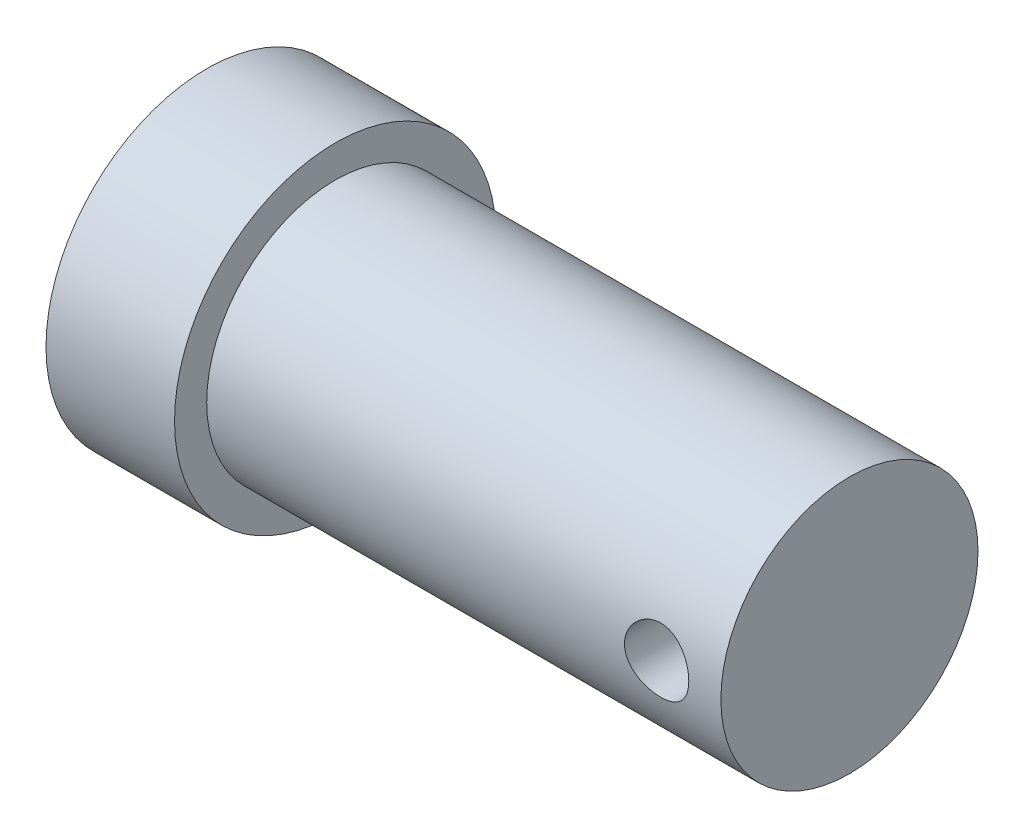
ISO-10303-21;
HEADER;
FILE_DESCRIPTION(('STEP AP214'),'2;1');
FILE_NAME('part.step','',(''),(''),'','','');
FILE_SCHEMA(('AUTOMOTIVE_DESIGN { 1 0 10303 214 1 1 1 1 }'));
ENDSEC;
DATA;
#1=APPLICATION_CONTEXT('core data for automotive mechanical design processes');
#2=APPLICATION_PROTOCOL_DEFINITION('international standard','automotive_design',2000,#1);
#3=PRODUCT_CONTEXT('',#1,'mechanical');
#4=PRODUCT('Part','Part','',(#3));
#5=PRODUCT_RELATED_PRODUCT_CATEGORY('part','',(#4));
#6=PRODUCT_DEFINITION_FORMATION('','',#4);
#7=PRODUCT_DEFINITION_CONTEXT('part definition',#1,'design');
#8=PRODUCT_DEFINITION('design','',#6,#7);
#9=PRODUCT_DEFINITION_SHAPE('','',#8);
#10=(LENGTH_UNIT() NAMED_UNIT(*) SI_UNIT(.MILLI.,.METRE.));
#11=(NAMED_UNIT(*) PLANE_ANGLE_UNIT() SI_UNIT($,.RADIAN.));
#12=(NAMED_UNIT(*) SI_UNIT($,.STERADIAN.) SOLID_ANGLE_UNIT());
#13=UNCERTAINTY_MEASURE_WITH_UNIT(LENGTH_MEASURE(1.E-05),#10,'distance_accuracy_value','');
#14=(GEOMETRIC_REPRESENTATION_CONTEXT(3) GLOBAL_UNCERTAINTY_ASSIGNED_CONTEXT((#13)) GLOBAL_UNIT_ASSIGNED_CONTEXT((#10,
#11,#12)) REPRESENTATION_CONTEXT('',''));
#15=CARTESIAN_POINT('',(0.,0.,0.));
#16=DIRECTION('',(0.,0.,1.));
#17=DIRECTION('',(1.,0.,0.));
#18=AXIS2_PLACEMENT_3D('',#15,#16,#17);
#19=CARTESIAN_POINT('',(0.,0.,0.));
#20=DIRECTION('',(1.,0.,0.));
#21=DIRECTION('',(0.,0.,-1.));
#22=AXIS2_PLACEMENT_3D('',#19,#20,#21);
#23=PLANE('',#22);
#24=CARTESIAN_POINT('',(0.,0.,0.));
#25=DIRECTION('',(-1.,0.,0.));
#26=DIRECTION('',(0.,0.,1.));
#27=AXIS2_PLACEMENT_3D('',#24,#25,#26);
#28=CIRCLE('',#27,25.);
#29=CARTESIAN_POINT('',(0.,0.,25.));
#30=VERTEX_POINT('',#29);
#31=EDGE_CURVE('E45',#30,#30,#28,.T.);
#32=ORIENTED_EDGE('',*,*,#31,.T.);
#33=EDGE_LOOP('',(#32));
#34=FACE_BOUND('',#33,.T.);
#35=ADVANCED_FACE('F30',(#34),#23,.F.);
#36=CARTESIAN_POINT('',(0.,0.,0.));
#37=DIRECTION('',(-1.,0.,0.));
#38=DIRECTION('',(0.,0.,1.));
#39=AXIS2_PLACEMENT_3D('',#36,#37,#38);
#40=CYLINDRICAL_SURFACE('',#39,25.);
#41=ORIENTED_EDGE('',*,*,#31,.F.);
#42=EDGE_LOOP('',(#41));
#43=FACE_BOUND('',#42,.T.);
#44=CARTESIAN_POINT('',(20.,0.,0.));
#45=DIRECTION('',(-1.,0.,0.));
#46=DIRECTION('',(0.,0.,1.));
#47=AXIS2_PLACEMENT_3D('',#44,#45,#46);
#48=CIRCLE('',#47,25.);
#49=CARTESIAN_POINT('',(20.,0.,25.));
#50=VERTEX_POINT('',#49);
#51=EDGE_CURVE('E49',#50,#50,#48,.T.);
#52=ORIENTED_EDGE('',*,*,#51,.T.);
#53=EDGE_LOOP('',(#52));
#54=FACE_BOUND('',#53,.T.);
#55=ADVANCED_FACE('F73',(#43,#54),#40,.T.);
#56=CARTESIAN_POINT('',(20.,25.,0.));
#57=DIRECTION('',(-1.,0.,0.));
#58=DIRECTION('',(0.,0.,1.));
#59=AXIS2_PLACEMENT_3D('',#56,#57,#58);
#60=PLANE('',#59);
#61=ORIENTED_EDGE('',*,*,#51,.F.);
#62=EDGE_LOOP('',(#61));
#63=FACE_BOUND('',#62,.T.);
#64=CARTESIAN_POINT('',(20.,0.,0.));
#65=DIRECTION('',(-1.,0.,0.));
#66=DIRECTION('',(0.,0.,1.));
#67=AXIS2_PLACEMENT_3D('',#64,#65,#66);
#68=CIRCLE('',#67,20.);
#69=CARTESIAN_POINT('',(20.,0.,20.));
#70=VERTEX_POINT('',#69);
#71=EDGE_CURVE('E84',#70,#70,#68,.T.);
#72=ORIENTED_EDGE('',*,*,#71,.T.);
#73=EDGE_LOOP('',(#72));
#74=FACE_BOUND('',#73,.T.);
#75=ADVANCED_FACE('F70',(#63,#74),#60,.F.);
#76=CARTESIAN_POINT('',(0.,0.,0.));
#77=DIRECTION('',(-1.,0.,0.));
#78=DIRECTION('',(0.,0.,1.));
#79=AXIS2_PLACEMENT_3D('',#76,#77,#78);
#80=CYLINDRICAL_SURFACE('',#79,20.);
#81=CARTESIAN_POINT('',(95.,0.,-20.));
#82=CARTESIAN_POINT('',(94.9999922475395,0.276253628899104,-19.9999953289337));
#83=CARTESIAN_POINT('',(94.9770281640874,0.552593859435878,-19.9942192710609));
#84=CARTESIAN_POINT('',(94.88591616231,1.09735441256844,-19.9717371276631));
#85=CARTESIAN_POINT('',(94.8177426348738,1.3657701562358,-19.9550248473325));
#86=CARTESIAN_POINT('',(94.6385358217931,1.88673624060859,-19.9125208777344));
#87=CARTESIAN_POINT('',(94.5275540042825,2.13930521143334,-19.8867400947353));
#88=CARTESIAN_POINT('',(94.2660620331839,2.62224043968143,-19.8288447935874));
#89=CARTESIAN_POINT('',(94.1155505462701,2.85260594782922,-19.7967300618052));
#90=CARTESIAN_POINT('',(93.7759973678194,3.28933975766972,-19.7289137863898));
#91=CARTESIAN_POINT('',(93.5862947501365,3.49518563353686,-19.6931569049375));
#92=CARTESIAN_POINT('',(93.1751593169699,3.87249642401107,-19.6224540039312));
#93=CARTESIAN_POINT('',(92.9537229235102,4.04395745649731,-19.5875080763289));
#94=CARTESIAN_POINT('',(92.48134924421,4.35008847599659,-19.5218258566056));
#95=CARTESIAN_POINT('',(92.2300225639709,4.48417405308381,-19.4911598154937));
#96=CARTESIAN_POINT('',(91.7075052944665,4.70798969516915,-19.4383164939339));
#97=CARTESIAN_POINT('',(91.4363178888933,4.79772685146714,-19.4161378564806));
#98=CARTESIAN_POINT('',(90.8875216726612,4.92851612268255,-19.3833492232108));
#99=CARTESIAN_POINT('',(90.61015034654,4.97050756110685,-19.372516366567));
#100=CARTESIAN_POINT('',(90.0521047700022,5.00753925022137,-19.362978748653));
#101=CARTESIAN_POINT('',(89.7714310643595,5.00258713939371,-19.3642720142643));
#102=CARTESIAN_POINT('',(89.2219473075155,4.94662174879902,-19.3786401838939));
#103=CARTESIAN_POINT('',(88.9530145951156,4.89672780063545,-19.3914287669098));
#104=CARTESIAN_POINT('',(88.4274631636298,4.75408062300998,-19.426890322369));
#105=CARTESIAN_POINT('',(88.1708453232369,4.66132434023131,-19.4495639989746));
#106=CARTESIAN_POINT('',(87.6742066124929,4.43463159312396,-19.5025037968553));
#107=CARTESIAN_POINT('',(87.4343794273681,4.3002888907764,-19.5328442489939));
#108=CARTESIAN_POINT('',(86.9802709674773,3.99452092004982,-19.5976570281997));
#109=CARTESIAN_POINT('',(86.7659941731092,3.82308916269613,-19.6321300778209));
#110=CARTESIAN_POINT('',(86.362654614352,3.44221141560407,-19.7025293513297));
#111=CARTESIAN_POINT('',(86.1744850331288,3.23182086055287,-19.7384689826));
#112=CARTESIAN_POINT('',(85.835929191787,2.78203972501233,-19.8068655192919));
#113=CARTESIAN_POINT('',(85.6855440857881,2.54264825902648,-19.8393223183136));
#114=CARTESIAN_POINT('',(85.4264980459187,2.04038629560464,-19.897257736473));
#115=CARTESIAN_POINT('',(85.3179821991519,1.77743797736208,-19.9227120042576));
#116=CARTESIAN_POINT('',(85.1469423143014,1.23625336047628,-19.9635972330472));
#117=CARTESIAN_POINT('',(85.0844094786062,0.958019997168289,-19.9790301113094));
#118=CARTESIAN_POINT('',(85.0084747814706,0.401799901300098,-19.9978499757125));
#119=CARTESIAN_POINT('',(84.993856579749,0.123989066627374,-20.0015351169426));
#120=CARTESIAN_POINT('',(85.0108300068516,-0.43010958267169,-19.9972934938151));
#121=CARTESIAN_POINT('',(85.0424174759971,-0.706397532148651,-19.9893677747284));
#122=CARTESIAN_POINT('',(85.1499030279712,-1.24538089592163,-19.9629860375784));
#123=CARTESIAN_POINT('',(85.2251375449233,-1.50821706322917,-19.9446878061929));
#124=CARTESIAN_POINT('',(85.4170236134282,-2.01752430817505,-19.899623554472));
#125=CARTESIAN_POINT('',(85.5336793477107,-2.26399373010884,-19.8728566789995));
#126=CARTESIAN_POINT('',(85.8074537629156,-2.73841044809944,-19.8131102642072));
#127=CARTESIAN_POINT('',(85.9652537079886,-2.96595147278589,-19.7800289122193));
#128=CARTESIAN_POINT('',(86.3159663626572,-3.39175537881104,-19.7114836395924));
#129=CARTESIAN_POINT('',(86.5088851320588,-3.59001319657751,-19.676019308434));
#130=CARTESIAN_POINT('',(86.9300065361457,-3.95663522690827,-19.6056318986475));
#131=CARTESIAN_POINT('',(87.1589590099987,-4.12414622540362,-19.57074347274));
#132=CARTESIAN_POINT('',(87.6424421148951,-4.41836919671215,-19.5064292794107));
#133=CARTESIAN_POINT('',(87.8969716099008,-4.54508298053823,-19.4770032695336));
#134=CARTESIAN_POINT('',(88.4230190746882,-4.75317140202426,-19.4272698238587));
#135=CARTESIAN_POINT('',(88.6944254277102,-4.83481465547784,-19.4069085073875));
#136=CARTESIAN_POINT('',(89.2476987928485,-4.95115219981057,-19.3775581342603));
#137=CARTESIAN_POINT('',(89.5295635033954,-4.98585675825596,-19.3685665905607));
#138=CARTESIAN_POINT('',(90.0870700795597,-5.00679530111928,-19.3631633735661));
#139=CARTESIAN_POINT('',(90.3626581171457,-4.99439299259116,-19.366397756045));
#140=CARTESIAN_POINT('',(90.907679628939,-4.92459092769654,-19.3842636317313));
#141=CARTESIAN_POINT('',(91.1771132267195,-4.86719207562107,-19.3988948958968));
#142=CARTESIAN_POINT('',(91.7006948635334,-4.70977106481403,-19.4377086899188));
#143=CARTESIAN_POINT('',(91.9549243507959,-4.61000468226919,-19.461833841343));
#144=CARTESIAN_POINT('',(92.4432179423838,-4.37088304534898,-19.5169251906949));
#145=CARTESIAN_POINT('',(92.6772792439577,-4.23152230011363,-19.5478923373231));
#146=CARTESIAN_POINT('',(93.1251820966721,-3.91289249545748,-19.6141878088207));
#147=CARTESIAN_POINT('',(93.3383369114129,-3.73267720970761,-19.6496088277351));
#148=CARTESIAN_POINT('',(93.7318234826517,-3.33929790396569,-19.7202675748663));
#149=CARTESIAN_POINT('',(93.91214743371,-3.12612607087045,-19.755505257566));
#150=CARTESIAN_POINT('',(94.2380376952153,-2.66822528900865,-19.8225885215915));
#151=CARTESIAN_POINT('',(94.3829153789053,-2.42299474105463,-19.8543611121963));
#152=CARTESIAN_POINT('',(94.6291582098018,-1.91088686503491,-19.9101641658366));
#153=CARTESIAN_POINT('',(94.7305545354951,-1.6440252114558,-19.9342001733259));
#154=CARTESIAN_POINT('',(94.8719061010988,-1.14803417747824,-19.9682686521849));
#155=CARTESIAN_POINT('',(94.9198374768448,-0.921267236360231,-19.9800861684231));
#156=CARTESIAN_POINT('',(94.9838864787398,-0.463020238454279,-19.9959535077316));
#157=CARTESIAN_POINT('',(95.0000064976844,-0.231540537475388,-20.0000039150298));
#158=CARTESIAN_POINT('',(95.,0.,-20.));
#159=B_SPLINE_CURVE_WITH_KNOTS('',3,(#81,#82,#83,#84,#85,#86,#87,#88,#89,#90,#91,#92,#93,#94,
#95,#96,#97,#98,#99,#100,#101,#102,#103,#104,#105,#106,#107,#108,#109,#110,#111,#112,#113,#114,
#115,#116,#117,#118,#119,#120,#121,#122,#123,#124,#125,#126,#127,#128,#129,#130,#131,#132,#133,
#134,#135,#136,#137,#138,#139,#140,#141,#142,#143,#144,#145,#146,#147,#148,#149,#150,#151,#152,
#153,#154,#155,#156,#157,#158),.UNSPECIFIED.,.T.,.F.,(4,2,2,2,2,2,2,2,2,2,2,2,2,2,2,2,2,2,2,2,2,
2,2,2,2,2,2,2,2,2,2,2,2,2,2,2,2,2,4),(0.,0.827912374906301,1.65629412587967,2.48368300762036,
3.31109980056443,4.1538145145713,4.9966243193354,5.85195491819358,6.70714870564562,
7.54520983670233,8.38313460386727,9.20074990034463,10.0184234489786,10.84435092924,
11.6704230279828,12.5200500324113,13.3697029853856,14.2222743004145,15.0746824563988,
15.9052769650866,16.7357967038688,17.5540091505786,18.3723042441871,19.2051195856224,
20.0380787670447,20.8914836402599,21.7448506250943,22.5930751539527,23.4411141086096,
24.2647926801851,25.0884546987996,25.9072133522467,26.7260856048285,27.5663192139288,
28.4067523259457,29.2624061835847,30.1174454609768,30.8114080983367,31.5053185350331),.UNSPECIFIED.);
#160=CARTESIAN_POINT('',(95.,0.,-20.));
#161=VERTEX_POINT('',#160);
#162=EDGE_CURVE('E10',#161,#161,#159,.T.);
#163=ORIENTED_EDGE('',*,*,#162,.T.);
#164=EDGE_LOOP('',(#163));
#165=FACE_BOUND('',#164,.T.);
#166=CARTESIAN_POINT('',(95.,0.,20.));
#167=CARTESIAN_POINT('',(94.9999922475395,-0.276253628899104,19.9999953289337));
#168=CARTESIAN_POINT('',(94.9770281640874,-0.552593859435878,19.9942192710609));
#169=CARTESIAN_POINT('',(94.88591616231,-1.09735441256844,19.9717371276631));
#170=CARTESIAN_POINT('',(94.8177426348738,-1.3657701562358,19.9550248473325));
#171=CARTESIAN_POINT('',(94.6385358217931,-1.88673624060859,19.9125208777344));
#172=CARTESIAN_POINT('',(94.5275540042825,-2.13930521143334,19.8867400947353));
#173=CARTESIAN_POINT('',(94.2660620331839,-2.62224043968143,19.8288447935874));
#174=CARTESIAN_POINT('',(94.1155505462701,-2.85260594782922,19.7967300618052));
#175=CARTESIAN_POINT('',(93.7759973678194,-3.28933975766972,19.7289137863898));
#176=CARTESIAN_POINT('',(93.5862947501365,-3.49518563353686,19.6931569049375));
#177=CARTESIAN_POINT('',(93.1751593169699,-3.87249642401107,19.6224540039312));
#178=CARTESIAN_POINT('',(92.9537229235102,-4.04395745649731,19.5875080763289));
#179=CARTESIAN_POINT('',(92.48134924421,-4.35008847599659,19.5218258566056));
#180=CARTESIAN_POINT('',(92.2300225639709,-4.48417405308381,19.4911598154937));
#181=CARTESIAN_POINT('',(91.7075052944665,-4.70798969516915,19.4383164939339));
#182=CARTESIAN_POINT('',(91.4363178888933,-4.79772685146714,19.4161378564806));
#183=CARTESIAN_POINT('',(90.8875216726612,-4.92851612268255,19.3833492232108));
#184=CARTESIAN_POINT('',(90.61015034654,-4.97050756110685,19.372516366567));
#185=CARTESIAN_POINT('',(90.0521047700022,-5.00753925022137,19.362978748653));
#186=CARTESIAN_POINT('',(89.7714310643595,-5.00258713939371,19.3642720142643));
#187=CARTESIAN_POINT('',(89.2219473075155,-4.94662174879902,19.3786401838939));
#188=CARTESIAN_POINT('',(88.9530145951156,-4.89672780063545,19.3914287669098));
#189=CARTESIAN_POINT('',(88.4274631636298,-4.75408062300998,19.426890322369));
#190=CARTESIAN_POINT('',(88.1708453232369,-4.66132434023131,19.4495639989746));
#191=CARTESIAN_POINT('',(87.6742066124929,-4.43463159312396,19.5025037968553));
#192=CARTESIAN_POINT('',(87.4343794273681,-4.3002888907764,19.5328442489939));
#193=CARTESIAN_POINT('',(86.9802709674773,-3.99452092004982,19.5976570281997));
#194=CARTESIAN_POINT('',(86.7659941731092,-3.82308916269613,19.6321300778209));
#195=CARTESIAN_POINT('',(86.362654614352,-3.44221141560407,19.7025293513297));
#196=CARTESIAN_POINT('',(86.1744850331288,-3.23182086055287,19.7384689826));
#197=CARTESIAN_POINT('',(85.835929191787,-2.78203972501233,19.8068655192919));
#198=CARTESIAN_POINT('',(85.6855440857881,-2.54264825902648,19.8393223183136));
#199=CARTESIAN_POINT('',(85.4264980459187,-2.04038629560464,19.897257736473));
#200=CARTESIAN_POINT('',(85.3179821991519,-1.77743797736208,19.9227120042576));
#201=CARTESIAN_POINT('',(85.1469423143014,-1.23625336047628,19.9635972330472));
#202=CARTESIAN_POINT('',(85.0844094786062,-0.958019997168289,19.9790301113094));
#203=CARTESIAN_POINT('',(85.0084747814706,-0.401799901300098,19.9978499757125));
#204=CARTESIAN_POINT('',(84.993856579749,-0.123989066627374,20.0015351169426));
#205=CARTESIAN_POINT('',(85.0108300068516,0.43010958267169,19.9972934938151));
#206=CARTESIAN_POINT('',(85.0424174759971,0.706397532148651,19.9893677747284));
#207=CARTESIAN_POINT('',(85.1499030279712,1.24538089592163,19.9629860375784));
#208=CARTESIAN_POINT('',(85.2251375449233,1.50821706322917,19.9446878061929));
#209=CARTESIAN_POINT('',(85.4170236134282,2.01752430817505,19.899623554472));
#210=CARTESIAN_POINT('',(85.5336793477107,2.26399373010884,19.8728566789995));
#211=CARTESIAN_POINT('',(85.8074537629156,2.73841044809944,19.8131102642072));
#212=CARTESIAN_POINT('',(85.9652537079886,2.96595147278589,19.7800289122193));
#213=CARTESIAN_POINT('',(86.3159663626572,3.39175537881104,19.7114836395924));
#214=CARTESIAN_POINT('',(86.5088851320588,3.59001319657751,19.676019308434));
#215=CARTESIAN_POINT('',(86.9300065361457,3.95663522690827,19.6056318986475));
#216=CARTESIAN_POINT('',(87.1589590099987,4.12414622540362,19.57074347274));
#217=CARTESIAN_POINT('',(87.6424421148951,4.41836919671215,19.5064292794107));
#218=CARTESIAN_POINT('',(87.8969716099008,4.54508298053823,19.4770032695336));
#219=CARTESIAN_POINT('',(88.4230190746882,4.75317140202426,19.4272698238587));
#220=CARTESIAN_POINT('',(88.6944254277102,4.83481465547784,19.4069085073875));
#221=CARTESIAN_POINT('',(89.2476987928485,4.95115219981057,19.3775581342603));
#222=CARTESIAN_POINT('',(89.5295635033954,4.98585675825596,19.3685665905607));
#223=CARTESIAN_POINT('',(90.0870700795597,5.00679530111928,19.3631633735661));
#224=CARTESIAN_POINT('',(90.3626581171457,4.99439299259116,19.366397756045));
#225=CARTESIAN_POINT('',(90.907679628939,4.92459092769654,19.3842636317313));
#226=CARTESIAN_POINT('',(91.1771132267195,4.86719207562107,19.3988948958968));
#227=CARTESIAN_POINT('',(91.7006948635334,4.70977106481403,19.4377086899188));
#228=CARTESIAN_POINT('',(91.9549243507959,4.61000468226919,19.461833841343));
#229=CARTESIAN_POINT('',(92.4432179423838,4.37088304534898,19.5169251906949));
#230=CARTESIAN_POINT('',(92.6772792439577,4.23152230011363,19.5478923373231));
#231=CARTESIAN_POINT('',(93.1251820966721,3.91289249545748,19.6141878088207));
#232=CARTESIAN_POINT('',(93.3383369114129,3.73267720970761,19.6496088277351));
#233=CARTESIAN_POINT('',(93.7318234826517,3.33929790396569,19.7202675748663));
#234=CARTESIAN_POINT('',(93.91214743371,3.12612607087045,19.755505257566));
#235=CARTESIAN_POINT('',(94.2380376952153,2.66822528900865,19.8225885215915));
#236=CARTESIAN_POINT('',(94.3829153789053,2.42299474105463,19.8543611121963));
#237=CARTESIAN_POINT('',(94.6291582098018,1.91088686503491,19.9101641658366));
#238=CARTESIAN_POINT('',(94.7305545354951,1.6440252114558,19.9342001733259));
#239=CARTESIAN_POINT('',(94.8719061010988,1.14803417747824,19.9682686521849));
#240=CARTESIAN_POINT('',(94.9198374768448,0.921267236360231,19.9800861684231));
#241=CARTESIAN_POINT('',(94.9838864787398,0.463020238454279,19.9959535077316));
#242=CARTESIAN_POINT('',(95.0000064976844,0.231540537475388,20.0000039150298));
#243=CARTESIAN_POINT('',(95.,0.,20.));
#244=B_SPLINE_CURVE_WITH_KNOTS('',3,(#166,#167,#168,#169,#170,#171,#172,#173,#174,#175,#176,
#177,#178,#179,#180,#181,#182,#183,#184,#185,#186,#187,#188,#189,#190,#191,#192,#193,#194,#195,
#196,#197,#198,#199,#200,#201,#202,#203,#204,#205,#206,#207,#208,#209,#210,#211,#212,#213,#214,
#215,#216,#217,#218,#219,#220,#221,#222,#223,#224,#225,#226,#227,#228,#229,#230,#231,#232,#233,
#234,#235,#236,#237,#238,#239,#240,#241,#242,#243),.UNSPECIFIED.,.T.,.F.,(4,2,2,2,2,2,2,2,2,2,2,
2,2,2,2,2,2,2,2,2,2,2,2,2,2,2,2,2,2,2,2,2,2,2,2,2,2,2,4),(0.,0.827912374906301,1.65629412587967,
2.48368300762036,3.31109980056443,4.1538145145713,4.9966243193354,5.85195491819358,
6.70714870564562,7.54520983670233,8.38313460386727,9.20074990034463,10.0184234489786,
10.84435092924,11.6704230279828,12.5200500324113,13.3697029853856,14.2222743004145,
15.0746824563988,15.9052769650866,16.7357967038688,17.5540091505786,18.3723042441871,
19.2051195856224,20.0380787670447,20.8914836402599,21.7448506250943,22.5930751539527,
23.4411141086096,24.2647926801851,25.0884546987996,25.9072133522467,26.7260856048285,
27.5663192139288,28.4067523259457,29.2624061835847,30.1174454609768,30.8114080983367,
31.5053185350331),.UNSPECIFIED.);
#245=CARTESIAN_POINT('',(95.,0.,20.));
#246=VERTEX_POINT('',#245);
#247=EDGE_CURVE('E41',#246,#246,#244,.T.);
#248=ORIENTED_EDGE('',*,*,#247,.T.);
#249=EDGE_LOOP('',(#248));
#250=FACE_BOUND('',#249,.T.);
#251=ORIENTED_EDGE('',*,*,#71,.F.);
#252=EDGE_LOOP('',(#251));
#253=FACE_BOUND('',#252,.T.);
#254=CARTESIAN_POINT('',(100.,0.,0.));
#255=DIRECTION('',(-1.,0.,0.));
#256=DIRECTION('',(0.,0.,1.));
#257=AXIS2_PLACEMENT_3D('',#254,#255,#256);
#258=CIRCLE('',#257,20.);
#259=CARTESIAN_POINT('',(100.,0.,20.));
#260=VERTEX_POINT('',#259);
#261=EDGE_CURVE('E86',#260,#260,#258,.T.);
#262=ORIENTED_EDGE('',*,*,#261,.T.);
#263=EDGE_LOOP('',(#262));
#264=FACE_BOUND('',#263,.T.);
#265=ADVANCED_FACE('F55',(#165,#250,#253,#264),#80,.T.);
#266=CARTESIAN_POINT('',(100.,20.,0.));
#267=DIRECTION('',(-1.,0.,0.));
#268=DIRECTION('',(0.,0.,1.));
#269=AXIS2_PLACEMENT_3D('',#266,#267,#268);
#270=PLANE('',#269);
#271=ORIENTED_EDGE('',*,*,#261,.F.);
#272=EDGE_LOOP('',(#271));
#273=FACE_BOUND('',#272,.T.);
#274=ADVANCED_FACE('F62',(#273),#270,.F.);
#275=CARTESIAN_POINT('',(90.,0.,-20.));
#276=DIRECTION('',(0.,0.,1.));
#277=DIRECTION('',(1.,0.,0.));
#278=AXIS2_PLACEMENT_3D('',#275,#276,#277);
#279=CYLINDRICAL_SURFACE('',#278,5.);
#280=ORIENTED_EDGE('',*,*,#247,.F.);
#281=EDGE_LOOP('',(#280));
#282=FACE_BOUND('',#281,.T.);
#283=ORIENTED_EDGE('',*,*,#162,.F.);
#284=EDGE_LOOP('',(#283));
#285=FACE_BOUND('',#284,.T.);
#286=ADVANCED_FACE('F59',(#282,#285),#279,.F.);
#287=CLOSED_SHELL('',(#35,#55,#75,#265,#274,#286));
#288=MANIFOLD_SOLID_BREP('B2',#287);
#289=ADVANCED_BREP_SHAPE_REPRESENTATION('',(#18,#288),#14);
#290=SHAPE_DEFINITION_REPRESENTATION(#9,#289);
ENDSEC;
END-ISO-10303-21;
